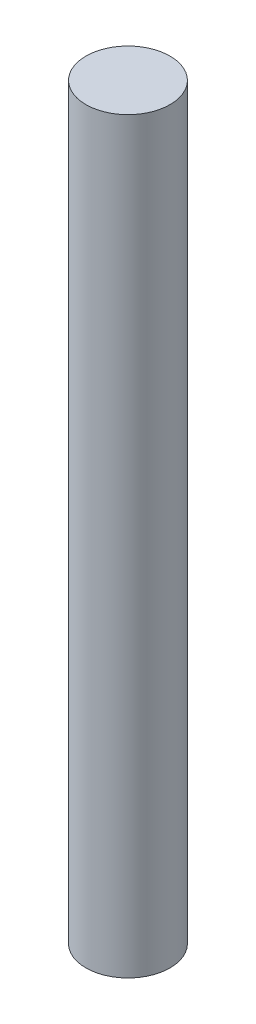
ISO-10303-21;
HEADER;
FILE_DESCRIPTION(('STEP AP214'),'2;1');
FILE_NAME('part.step','',(''),(''),'','','');
FILE_SCHEMA(('AUTOMOTIVE_DESIGN { 1 0 10303 214 1 1 1 1 }'));
ENDSEC;
DATA;
#1=APPLICATION_CONTEXT('core data for automotive mechanical design processes');
#2=APPLICATION_PROTOCOL_DEFINITION('international standard','automotive_design',2000,#1);
#3=PRODUCT_CONTEXT('',#1,'mechanical');
#4=PRODUCT('Part','Part','',(#3));
#5=PRODUCT_RELATED_PRODUCT_CATEGORY('part','',(#4));
#6=PRODUCT_DEFINITION_FORMATION('','',#4);
#7=PRODUCT_DEFINITION_CONTEXT('part definition',#1,'design');
#8=PRODUCT_DEFINITION('design','',#6,#7);
#9=PRODUCT_DEFINITION_SHAPE('','',#8);
#10=(LENGTH_UNIT() NAMED_UNIT(*) SI_UNIT(.MILLI.,.METRE.));
#11=(NAMED_UNIT(*) PLANE_ANGLE_UNIT() SI_UNIT($,.RADIAN.));
#12=(NAMED_UNIT(*) SI_UNIT($,.STERADIAN.) SOLID_ANGLE_UNIT());
#13=UNCERTAINTY_MEASURE_WITH_UNIT(LENGTH_MEASURE(1.E-05),#10,'distance_accuracy_value','');
#14=(GEOMETRIC_REPRESENTATION_CONTEXT(3) GLOBAL_UNCERTAINTY_ASSIGNED_CONTEXT((#13)) GLOBAL_UNIT_ASSIGNED_CONTEXT((#10,
#11,#12)) REPRESENTATION_CONTEXT('',''));
#15=CARTESIAN_POINT('',(0.,0.,0.));
#16=DIRECTION('',(0.,0.,1.));
#17=DIRECTION('',(1.,0.,0.));
#18=AXIS2_PLACEMENT_3D('',#15,#16,#17);
#19=CARTESIAN_POINT('',(0.,40.,0.));
#20=DIRECTION('',(0.,-1.,0.));
#21=DIRECTION('',(0.,0.,-1.));
#22=AXIS2_PLACEMENT_3D('',#19,#20,#21);
#23=CYLINDRICAL_SURFACE('',#22,2.25);
#24=CARTESIAN_POINT('',(0.,40.,0.));
#25=DIRECTION('',(0.,1.,0.));
#26=DIRECTION('',(0.,0.,1.));
#27=AXIS2_PLACEMENT_3D('',#24,#25,#26);
#28=CIRCLE('',#27,2.25);
#29=CARTESIAN_POINT('',(0.,40.,2.25));
#30=VERTEX_POINT('',#29);
#31=EDGE_CURVE('E10',#30,#30,#28,.T.);
#32=ORIENTED_EDGE('',*,*,#31,.F.);
#33=EDGE_LOOP('',(#32));
#34=FACE_BOUND('',#33,.T.);
#35=CARTESIAN_POINT('',(0.,0.,0.));
#36=DIRECTION('',(0.,1.,0.));
#37=DIRECTION('',(0.,0.,1.));
#38=AXIS2_PLACEMENT_3D('',#35,#36,#37);
#39=CIRCLE('',#38,2.25);
#40=CARTESIAN_POINT('',(0.,0.,2.25));
#41=VERTEX_POINT('',#40);
#42=EDGE_CURVE('E40',#41,#41,#39,.T.);
#43=ORIENTED_EDGE('',*,*,#42,.T.);
#44=EDGE_LOOP('',(#43));
#45=FACE_BOUND('',#44,.T.);
#46=ADVANCED_FACE('F37',(#34,#45),#23,.T.);
#47=CARTESIAN_POINT('',(0.,40.,0.));
#48=DIRECTION('',(0.,1.,0.));
#49=DIRECTION('',(0.,0.,1.));
#50=AXIS2_PLACEMENT_3D('',#47,#48,#49);
#51=PLANE('',#50);
#52=ORIENTED_EDGE('',*,*,#31,.T.);
#53=EDGE_LOOP('',(#52));
#54=FACE_BOUND('',#53,.T.);
#55=ADVANCED_FACE('F52',(#54),#51,.T.);
#56=CARTESIAN_POINT('',(0.,0.,0.));
#57=DIRECTION('',(0.,1.,0.));
#58=DIRECTION('',(0.,0.,1.));
#59=AXIS2_PLACEMENT_3D('',#56,#57,#58);
#60=PLANE('',#59);
#61=ORIENTED_EDGE('',*,*,#42,.F.);
#62=EDGE_LOOP('',(#61));
#63=FACE_BOUND('',#62,.T.);
#64=ADVANCED_FACE('F50',(#63),#60,.F.);
#65=CLOSED_SHELL('',(#46,#55,#64));
#66=MANIFOLD_SOLID_BREP('B2',#65);
#67=ADVANCED_BREP_SHAPE_REPRESENTATION('',(#18,#66),#14);
#68=SHAPE_DEFINITION_REPRESENTATION(#9,#67);
ENDSEC;
END-ISO-10303-21;
